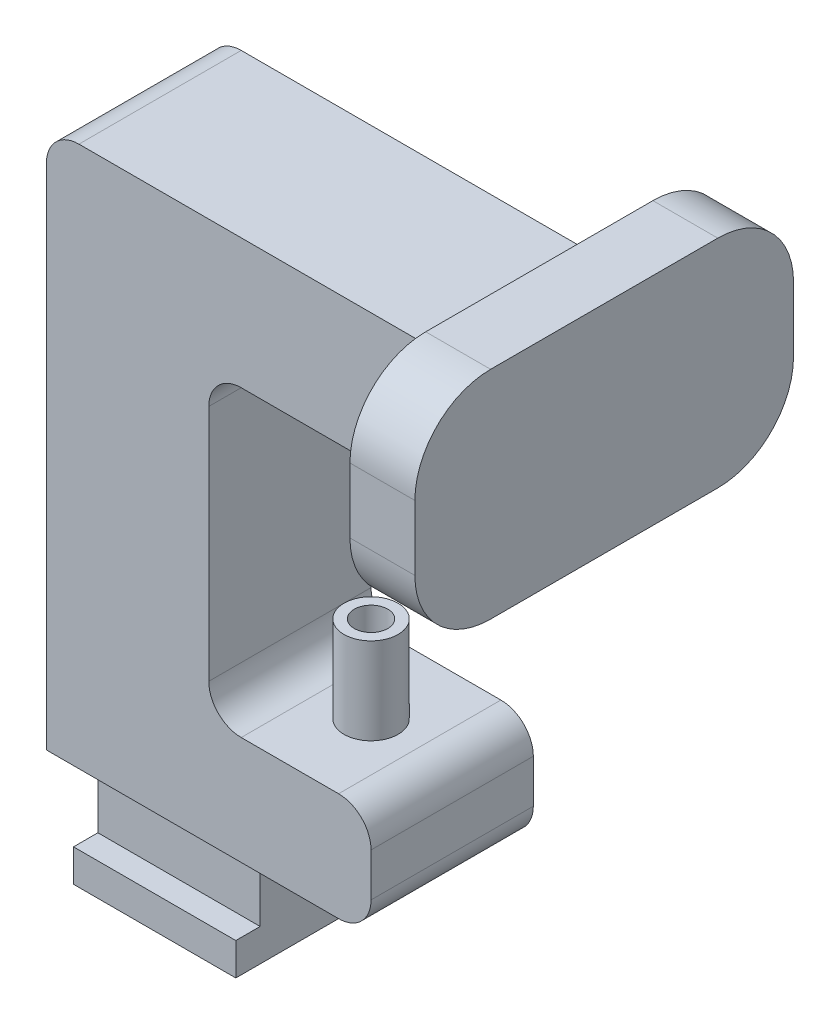
ISO-10303-21;
HEADER;
FILE_DESCRIPTION(('STEP AP214'),'2;1');
FILE_NAME('part.step','',(''),(''),'','','');
FILE_SCHEMA(('AUTOMOTIVE_DESIGN { 1 0 10303 214 1 1 1 1 }'));
ENDSEC;
DATA;
#1=APPLICATION_CONTEXT('core data for automotive mechanical design processes');
#2=APPLICATION_PROTOCOL_DEFINITION('international standard','automotive_design',2000,#1);
#3=PRODUCT_CONTEXT('',#1,'mechanical');
#4=PRODUCT('Part','Part','',(#3));
#5=PRODUCT_RELATED_PRODUCT_CATEGORY('part','',(#4));
#6=PRODUCT_DEFINITION_FORMATION('','',#4);
#7=PRODUCT_DEFINITION_CONTEXT('part definition',#1,'design');
#8=PRODUCT_DEFINITION('design','',#6,#7);
#9=PRODUCT_DEFINITION_SHAPE('','',#8);
#10=(LENGTH_UNIT() NAMED_UNIT(*) SI_UNIT(.MILLI.,.METRE.));
#11=(NAMED_UNIT(*) PLANE_ANGLE_UNIT() SI_UNIT($,.RADIAN.));
#12=(NAMED_UNIT(*) SI_UNIT($,.STERADIAN.) SOLID_ANGLE_UNIT());
#13=UNCERTAINTY_MEASURE_WITH_UNIT(LENGTH_MEASURE(1.E-05),#10,'distance_accuracy_value','');
#14=(GEOMETRIC_REPRESENTATION_CONTEXT(3) GLOBAL_UNCERTAINTY_ASSIGNED_CONTEXT((#13)) GLOBAL_UNIT_ASSIGNED_CONTEXT((#10,
#11,#12)) REPRESENTATION_CONTEXT('',''));
#15=CARTESIAN_POINT('',(0.,0.,0.));
#16=DIRECTION('',(0.,0.,1.));
#17=DIRECTION('',(1.,0.,0.));
#18=AXIS2_PLACEMENT_3D('',#15,#16,#17);
#19=CARTESIAN_POINT('',(10.,0.,15.));
#20=DIRECTION('',(-1.,0.,0.));
#21=DIRECTION('',(0.,0.,1.));
#22=AXIS2_PLACEMENT_3D('',#19,#20,#21);
#23=PLANE('',#22);
#24=DIRECTION('',(0.,1.,0.));
#25=VECTOR('',#24,1.);
#26=CARTESIAN_POINT('',(10.,0.,15.));
#27=LINE('',#26,#25);
#28=CARTESIAN_POINT('',(10.,-37.,15.));
#29=VERTEX_POINT('',#28);
#30=CARTESIAN_POINT('',(10.,-15.,15.));
#31=VERTEX_POINT('',#30);
#32=EDGE_CURVE('E407',#29,#31,#27,.T.);
#33=ORIENTED_EDGE('',*,*,#32,.F.);
#34=DIRECTION('',(0.,0.,-1.));
#35=VECTOR('',#34,1.);
#36=CARTESIAN_POINT('',(10.,-37.,0.));
#37=LINE('',#36,#35);
#38=CARTESIAN_POINT('',(10.,-37.,0.));
#39=VERTEX_POINT('',#38);
#40=EDGE_CURVE('E516',#29,#39,#37,.T.);
#41=ORIENTED_EDGE('',*,*,#40,.T.);
#42=DIRECTION('',(0.,1.,0.));
#43=VECTOR('',#42,1.);
#44=CARTESIAN_POINT('',(10.,0.,0.));
#45=LINE('',#44,#43);
#46=CARTESIAN_POINT('',(10.,-15.,0.));
#47=VERTEX_POINT('',#46);
#48=EDGE_CURVE('E395',#39,#47,#45,.T.);
#49=ORIENTED_EDGE('',*,*,#48,.T.);
#50=DIRECTION('',(0.,0.,-1.));
#51=VECTOR('',#50,1.);
#52=CARTESIAN_POINT('',(10.,-15.,15.));
#53=LINE('',#52,#51);
#54=EDGE_CURVE('E513',#47,#31,#53,.F.);
#55=ORIENTED_EDGE('',*,*,#54,.T.);
#56=EDGE_LOOP('',(#33,#41,#49,#55));
#57=FACE_BOUND('',#56,.T.);
#58=ADVANCED_FACE('F49',(#57),#23,.F.);
#59=CARTESIAN_POINT('',(10.,-40.,15.));
#60=DIRECTION('',(0.,-1.,0.));
#61=DIRECTION('',(0.,0.,-1.));
#62=AXIS2_PLACEMENT_3D('',#59,#60,#61);
#63=PLANE('',#62);
#64=DIRECTION('',(-1.,0.,0.));
#65=VECTOR('',#64,1.);
#66=CARTESIAN_POINT('',(10.,-40.,15.));
#67=LINE('',#66,#65);
#68=CARTESIAN_POINT('',(22.,-40.,15.));
#69=VERTEX_POINT('',#68);
#70=CARTESIAN_POINT('',(13.,-40.,15.));
#71=VERTEX_POINT('',#70);
#72=EDGE_CURVE('E403',#69,#71,#67,.T.);
#73=ORIENTED_EDGE('',*,*,#72,.F.);
#74=DIRECTION('',(0.,0.,-1.));
#75=VECTOR('',#74,1.);
#76=CARTESIAN_POINT('',(22.,-40.,15.));
#77=LINE('',#76,#75);
#78=CARTESIAN_POINT('',(22.,-40.,0.));
#79=VERTEX_POINT('',#78);
#80=EDGE_CURVE('E509',#69,#79,#77,.T.);
#81=ORIENTED_EDGE('',*,*,#80,.T.);
#82=DIRECTION('',(-1.,0.,0.));
#83=VECTOR('',#82,1.);
#84=CARTESIAN_POINT('',(10.,-40.,0.));
#85=LINE('',#84,#83);
#86=CARTESIAN_POINT('',(13.,-40.,0.));
#87=VERTEX_POINT('',#86);
#88=EDGE_CURVE('E417',#79,#87,#85,.T.);
#89=ORIENTED_EDGE('',*,*,#88,.T.);
#90=DIRECTION('',(0.,0.,-1.));
#91=VECTOR('',#90,1.);
#92=CARTESIAN_POINT('',(13.,-40.,15.));
#93=LINE('',#92,#91);
#94=EDGE_CURVE('E506',#87,#71,#93,.F.);
#95=ORIENTED_EDGE('',*,*,#94,.T.);
#96=EDGE_LOOP('',(#73,#81,#89,#95));
#97=FACE_BOUND('',#96,.T.);
#98=CARTESIAN_POINT('',(17.5,-40.,7.5));
#99=DIRECTION('',(0.,-1.,0.));
#100=DIRECTION('',(0.,0.,-1.));
#101=AXIS2_PLACEMENT_3D('',#98,#99,#100);
#102=CIRCLE('',#101,2.5);
#103=CARTESIAN_POINT('',(17.5,-40.,5.));
#104=VERTEX_POINT('',#103);
#105=EDGE_CURVE('E411',#104,#104,#102,.F.);
#106=ORIENTED_EDGE('',*,*,#105,.F.);
#107=EDGE_LOOP('',(#106));
#108=FACE_BOUND('',#107,.T.);
#109=ADVANCED_FACE('F661',(#97,#108),#63,.F.);
#110=CARTESIAN_POINT('',(0.,-50.,15.));
#111=DIRECTION('',(0.,1.,0.));
#112=DIRECTION('',(0.,0.,1.));
#113=AXIS2_PLACEMENT_3D('',#110,#111,#112);
#114=PLANE('',#113);
#115=CARTESIAN_POINT('',(17.5,-50.,7.5));
#116=DIRECTION('',(0.,1.,0.));
#117=DIRECTION('',(0.,0.,1.));
#118=AXIS2_PLACEMENT_3D('',#115,#116,#117);
#119=CIRCLE('',#118,1.55);
#120=CARTESIAN_POINT('',(17.5,-50.,9.05));
#121=VERTEX_POINT('',#120);
#122=EDGE_CURVE('E335',#121,#121,#119,.T.);
#123=ORIENTED_EDGE('',*,*,#122,.T.);
#124=EDGE_LOOP('',(#123));
#125=FACE_BOUND('',#124,.T.);
#126=DIRECTION('',(1.,0.,0.));
#127=VECTOR('',#126,1.);
#128=CARTESIAN_POINT('',(0.,-50.,0.));
#129=LINE('',#128,#127);
#130=CARTESIAN_POINT('',(-5.,-50.,0.));
#131=VERTEX_POINT('',#130);
#132=CARTESIAN_POINT('',(22.,-50.,0.));
#133=VERTEX_POINT('',#132);
#134=EDGE_CURVE('E270',#131,#133,#129,.T.);
#135=ORIENTED_EDGE('',*,*,#134,.T.);
#136=DIRECTION('',(0.,0.,-1.));
#137=VECTOR('',#136,1.);
#138=CARTESIAN_POINT('',(22.,-50.,15.));
#139=LINE('',#138,#137);
#140=CARTESIAN_POINT('',(22.,-50.,15.));
#141=VERTEX_POINT('',#140);
#142=EDGE_CURVE('E494',#133,#141,#139,.F.);
#143=ORIENTED_EDGE('',*,*,#142,.T.);
#144=DIRECTION('',(1.,0.,0.));
#145=VECTOR('',#144,1.);
#146=CARTESIAN_POINT('',(0.,-50.,15.));
#147=LINE('',#146,#145);
#148=CARTESIAN_POINT('',(-5.,-50.,15.));
#149=VERTEX_POINT('',#148);
#150=EDGE_CURVE('E394',#149,#141,#147,.T.);
#151=ORIENTED_EDGE('',*,*,#150,.F.);
#152=DIRECTION('',(0.,0.,1.));
#153=VECTOR('',#152,1.);
#154=CARTESIAN_POINT('',(-5.,-50.,10.25));
#155=LINE('',#154,#153);
#156=CARTESIAN_POINT('',(-5.,-50.,10.25));
#157=VERTEX_POINT('',#156);
#158=EDGE_CURVE('E314',#157,#149,#155,.T.);
#159=ORIENTED_EDGE('',*,*,#158,.F.);
#160=DIRECTION('',(-1.,0.,0.));
#161=VECTOR('',#160,1.);
#162=CARTESIAN_POINT('',(10.,-50.,10.25));
#163=LINE('',#162,#161);
#164=CARTESIAN_POINT('',(10.,-50.,10.25));
#165=VERTEX_POINT('',#164);
#166=EDGE_CURVE('E368',#165,#157,#163,.T.);
#167=ORIENTED_EDGE('',*,*,#166,.F.);
#168=DIRECTION('',(0.,0.,1.));
#169=VECTOR('',#168,1.);
#170=CARTESIAN_POINT('',(10.,-50.,0.));
#171=LINE('',#170,#169);
#172=CARTESIAN_POINT('',(10.,-50.,4.75000000000001));
#173=VERTEX_POINT('',#172);
#174=EDGE_CURVE('E343',#173,#165,#171,.T.);
#175=ORIENTED_EDGE('',*,*,#174,.F.);
#176=DIRECTION('',(-1.,0.,0.));
#177=VECTOR('',#176,1.);
#178=CARTESIAN_POINT('',(10.,-50.,4.75000000000001));
#179=LINE('',#178,#177);
#180=CARTESIAN_POINT('',(-5.,-50.,4.75000000000001));
#181=VERTEX_POINT('',#180);
#182=EDGE_CURVE('E282',#173,#181,#179,.T.);
#183=ORIENTED_EDGE('',*,*,#182,.T.);
#184=DIRECTION('',(0.,0.,1.));
#185=VECTOR('',#184,1.);
#186=CARTESIAN_POINT('',(-5.,-50.,0.));
#187=LINE('',#186,#185);
#188=EDGE_CURVE('E261',#131,#181,#187,.T.);
#189=ORIENTED_EDGE('',*,*,#188,.F.);
#190=EDGE_LOOP('',(#135,#143,#151,#159,#167,#175,#183,#189));
#191=FACE_BOUND('',#190,.T.);
#192=ADVANCED_FACE('F280',(#125,#191),#114,.F.);
#193=CARTESIAN_POINT('',(0.,0.,15.));
#194=DIRECTION('',(0.,-1.,0.));
#195=DIRECTION('',(0.,0.,-1.));
#196=AXIS2_PLACEMENT_3D('',#193,#194,#195);
#197=PLANE('',#196);
#198=DIRECTION('',(-1.,0.,0.));
#199=VECTOR('',#198,1.);
#200=CARTESIAN_POINT('',(0.,0.,15.));
#201=LINE('',#200,#199);
#202=CARTESIAN_POINT('',(32.05,0.,15.));
#203=VERTEX_POINT('',#202);
#204=CARTESIAN_POINT('',(-2.,0.,15.));
#205=VERTEX_POINT('',#204);
#206=EDGE_CURVE('E391',#203,#205,#201,.T.);
#207=ORIENTED_EDGE('',*,*,#206,.F.);
#208=DIRECTION('',(0.,0.,1.));
#209=VECTOR('',#208,1.);
#210=CARTESIAN_POINT('',(32.05,0.,15.));
#211=LINE('',#210,#209);
#212=CARTESIAN_POINT('',(32.05,0.,0.));
#213=VERTEX_POINT('',#212);
#214=EDGE_CURVE('E73',#203,#213,#211,.F.);
#215=ORIENTED_EDGE('',*,*,#214,.T.);
#216=DIRECTION('',(-1.,0.,0.));
#217=VECTOR('',#216,1.);
#218=CARTESIAN_POINT('',(0.,0.,0.));
#219=LINE('',#218,#217);
#220=CARTESIAN_POINT('',(-2.,0.,0.));
#221=VERTEX_POINT('',#220);
#222=EDGE_CURVE('E278',#213,#221,#219,.T.);
#223=ORIENTED_EDGE('',*,*,#222,.T.);
#224=DIRECTION('',(0.,0.,-1.));
#225=VECTOR('',#224,1.);
#226=CARTESIAN_POINT('',(-2.,0.,15.));
#227=LINE('',#226,#225);
#228=EDGE_CURVE('E526',#221,#205,#227,.F.);
#229=ORIENTED_EDGE('',*,*,#228,.T.);
#230=EDGE_LOOP('',(#207,#215,#223,#229));
#231=FACE_BOUND('',#230,.T.);
#232=ADVANCED_FACE('F678',(#231),#197,.F.);
#233=CARTESIAN_POINT('',(25.,-50.,15.));
#234=DIRECTION('',(-1.,0.,0.));
#235=DIRECTION('',(0.,0.,1.));
#236=AXIS2_PLACEMENT_3D('',#233,#234,#235);
#237=PLANE('',#236);
#238=DIRECTION('',(0.,1.,0.));
#239=VECTOR('',#238,1.);
#240=CARTESIAN_POINT('',(25.,-50.,15.));
#241=LINE('',#240,#239);
#242=CARTESIAN_POINT('',(25.,-47.,15.));
#243=VERTEX_POINT('',#242);
#244=CARTESIAN_POINT('',(25.,-43.,15.));
#245=VERTEX_POINT('',#244);
#246=EDGE_CURVE('E399',#243,#245,#241,.T.);
#247=ORIENTED_EDGE('',*,*,#246,.F.);
#248=DIRECTION('',(0.,0.,-1.));
#249=VECTOR('',#248,1.);
#250=CARTESIAN_POINT('',(25.,-47.,15.));
#251=LINE('',#250,#249);
#252=CARTESIAN_POINT('',(25.,-47.,0.));
#253=VERTEX_POINT('',#252);
#254=EDGE_CURVE('E482',#243,#253,#251,.T.);
#255=ORIENTED_EDGE('',*,*,#254,.T.);
#256=DIRECTION('',(0.,1.,0.));
#257=VECTOR('',#256,1.);
#258=CARTESIAN_POINT('',(25.,-50.,0.));
#259=LINE('',#258,#257);
#260=CARTESIAN_POINT('',(25.,-43.,0.));
#261=VERTEX_POINT('',#260);
#262=EDGE_CURVE('E277',#253,#261,#259,.T.);
#263=ORIENTED_EDGE('',*,*,#262,.T.);
#264=DIRECTION('',(0.,0.,-1.));
#265=VECTOR('',#264,1.);
#266=CARTESIAN_POINT('',(25.,-43.,15.));
#267=LINE('',#266,#265);
#268=EDGE_CURVE('E479',#261,#245,#267,.F.);
#269=ORIENTED_EDGE('',*,*,#268,.T.);
#270=EDGE_LOOP('',(#247,#255,#263,#269));
#271=FACE_BOUND('',#270,.T.);
#272=ADVANCED_FACE('F674',(#271),#237,.F.);
#273=CARTESIAN_POINT('',(0.,0.,15.));
#274=DIRECTION('',(0.,0.,-1.));
#275=DIRECTION('',(-1.,0.,0.));
#276=AXIS2_PLACEMENT_3D('',#273,#274,#275);
#277=PLANE('',#276);
#278=DIRECTION('',(-1.,0.,0.));
#279=VECTOR('',#278,1.);
#280=CARTESIAN_POINT('',(33.05,-12.,15.));
#281=LINE('',#280,#279);
#282=CARTESIAN_POINT('',(32.05,-12.,15.));
#283=VERTEX_POINT('',#282);
#284=CARTESIAN_POINT('',(13.,-12.,15.));
#285=VERTEX_POINT('',#284);
#286=EDGE_CURVE('E324',#283,#285,#281,.T.);
#287=ORIENTED_EDGE('',*,*,#286,.F.);
#288=DIRECTION('',(0.,-1.,0.));
#289=VECTOR('',#288,1.);
#290=CARTESIAN_POINT('',(32.05,0.,15.));
#291=LINE('',#290,#289);
#292=EDGE_CURVE('E556',#283,#203,#291,.F.);
#293=ORIENTED_EDGE('',*,*,#292,.T.);
#294=ORIENTED_EDGE('',*,*,#206,.T.);
#295=CARTESIAN_POINT('',(-2.,-3.,15.));
#296=DIRECTION('',(0.,0.,-1.));
#297=DIRECTION('',(-1.,0.,0.));
#298=AXIS2_PLACEMENT_3D('',#295,#296,#297);
#299=CIRCLE('',#298,3.);
#300=CARTESIAN_POINT('',(-5.,-3.00000000000002,15.));
#301=VERTEX_POINT('',#300);
#302=EDGE_CURVE('E497',#205,#301,#299,.F.);
#303=ORIENTED_EDGE('',*,*,#302,.T.);
#304=DIRECTION('',(0.,1.,0.));
#305=VECTOR('',#304,1.);
#306=CARTESIAN_POINT('',(-5.,-50.,15.));
#307=LINE('',#306,#305);
#308=EDGE_CURVE('E318',#149,#301,#307,.T.);
#309=ORIENTED_EDGE('',*,*,#308,.F.);
#310=ORIENTED_EDGE('',*,*,#150,.T.);
#311=CARTESIAN_POINT('',(22.,-47.,15.));
#312=DIRECTION('',(0.,0.,-1.));
#313=DIRECTION('',(-1.,0.,0.));
#314=AXIS2_PLACEMENT_3D('',#311,#312,#313);
#315=CIRCLE('',#314,3.);
#316=EDGE_CURVE('E503',#141,#243,#315,.F.);
#317=ORIENTED_EDGE('',*,*,#316,.T.);
#318=ORIENTED_EDGE('',*,*,#246,.T.);
#319=CARTESIAN_POINT('',(22.,-43.,15.));
#320=DIRECTION('',(0.,0.,-1.));
#321=DIRECTION('',(-1.,0.,0.));
#322=AXIS2_PLACEMENT_3D('',#319,#320,#321);
#323=CIRCLE('',#322,3.);
#324=EDGE_CURVE('E500',#245,#69,#323,.F.);
#325=ORIENTED_EDGE('',*,*,#324,.T.);
#326=ORIENTED_EDGE('',*,*,#72,.T.);
#327=CARTESIAN_POINT('',(13.,-37.,15.));
#328=DIRECTION('',(0.,0.,-1.));
#329=DIRECTION('',(-1.,0.,0.));
#330=AXIS2_PLACEMENT_3D('',#327,#328,#329);
#331=CIRCLE('',#330,3.);
#332=EDGE_CURVE('E533',#71,#29,#331,.T.);
#333=ORIENTED_EDGE('',*,*,#332,.T.);
#334=ORIENTED_EDGE('',*,*,#32,.T.);
#335=CARTESIAN_POINT('',(13.,-15.,15.));
#336=DIRECTION('',(0.,0.,-1.));
#337=DIRECTION('',(-1.,0.,0.));
#338=AXIS2_PLACEMENT_3D('',#335,#336,#337);
#339=CIRCLE('',#338,3.);
#340=EDGE_CURVE('E539',#31,#285,#339,.T.);
#341=ORIENTED_EDGE('',*,*,#340,.T.);
#342=EDGE_LOOP('',(#287,#293,#294,#303,#309,#310,#317,#318,#325,#326,#333,#334,#341));
#343=FACE_BOUND('',#342,.T.);
#344=ADVANCED_FACE('F677',(#343),#277,.F.);
#345=CARTESIAN_POINT('',(0.,0.,0.));
#346=DIRECTION('',(0.,0.,-1.));
#347=DIRECTION('',(-1.,0.,0.));
#348=AXIS2_PLACEMENT_3D('',#345,#346,#347);
#349=PLANE('',#348);
#350=ORIENTED_EDGE('',*,*,#222,.F.);
#351=DIRECTION('',(0.,1.,0.));
#352=VECTOR('',#351,1.);
#353=CARTESIAN_POINT('',(32.05,-12.,0.));
#354=LINE('',#353,#352);
#355=CARTESIAN_POINT('',(32.05,-12.,0.));
#356=VERTEX_POINT('',#355);
#357=EDGE_CURVE('E11',#213,#356,#354,.F.);
#358=ORIENTED_EDGE('',*,*,#357,.T.);
#359=DIRECTION('',(-1.,0.,0.));
#360=VECTOR('',#359,1.);
#361=CARTESIAN_POINT('',(33.05,-12.,0.));
#362=LINE('',#361,#360);
#363=CARTESIAN_POINT('',(13.,-12.,0.));
#364=VERTEX_POINT('',#363);
#365=EDGE_CURVE('E321',#356,#364,#362,.T.);
#366=ORIENTED_EDGE('',*,*,#365,.T.);
#367=CARTESIAN_POINT('',(13.,-15.,0.));
#368=DIRECTION('',(0.,0.,-1.));
#369=DIRECTION('',(-1.,0.,0.));
#370=AXIS2_PLACEMENT_3D('',#367,#368,#369);
#371=CIRCLE('',#370,3.);
#372=EDGE_CURVE('E536',#364,#47,#371,.F.);
#373=ORIENTED_EDGE('',*,*,#372,.T.);
#374=ORIENTED_EDGE('',*,*,#48,.F.);
#375=CARTESIAN_POINT('',(13.,-37.,0.));
#376=DIRECTION('',(0.,0.,-1.));
#377=DIRECTION('',(-1.,0.,0.));
#378=AXIS2_PLACEMENT_3D('',#375,#376,#377);
#379=CIRCLE('',#378,3.);
#380=EDGE_CURVE('E530',#39,#87,#379,.F.);
#381=ORIENTED_EDGE('',*,*,#380,.T.);
#382=ORIENTED_EDGE('',*,*,#88,.F.);
#383=CARTESIAN_POINT('',(22.,-43.,0.));
#384=DIRECTION('',(0.,0.,-1.));
#385=DIRECTION('',(-1.,0.,0.));
#386=AXIS2_PLACEMENT_3D('',#383,#384,#385);
#387=CIRCLE('',#386,3.);
#388=EDGE_CURVE('E489',#79,#261,#387,.T.);
#389=ORIENTED_EDGE('',*,*,#388,.T.);
#390=ORIENTED_EDGE('',*,*,#262,.F.);
#391=CARTESIAN_POINT('',(22.,-47.,0.));
#392=DIRECTION('',(0.,0.,-1.));
#393=DIRECTION('',(-1.,0.,0.));
#394=AXIS2_PLACEMENT_3D('',#391,#392,#393);
#395=CIRCLE('',#394,3.);
#396=EDGE_CURVE('E273',#253,#133,#395,.T.);
#397=ORIENTED_EDGE('',*,*,#396,.T.);
#398=ORIENTED_EDGE('',*,*,#134,.F.);
#399=DIRECTION('',(0.,-1.,0.));
#400=VECTOR('',#399,1.);
#401=CARTESIAN_POINT('',(-5.,0.,0.));
#402=LINE('',#401,#400);
#403=CARTESIAN_POINT('',(-5.,-3.,0.));
#404=VERTEX_POINT('',#403);
#405=EDGE_CURVE('E255',#404,#131,#402,.T.);
#406=ORIENTED_EDGE('',*,*,#405,.F.);
#407=CARTESIAN_POINT('',(-2.,-3.,0.));
#408=DIRECTION('',(0.,0.,-1.));
#409=DIRECTION('',(-1.,0.,0.));
#410=AXIS2_PLACEMENT_3D('',#407,#408,#409);
#411=CIRCLE('',#410,3.);
#412=EDGE_CURVE('E486',#404,#221,#411,.T.);
#413=ORIENTED_EDGE('',*,*,#412,.T.);
#414=EDGE_LOOP('',(#350,#358,#366,#373,#374,#381,#382,#389,#390,#397,#398,#406,#413));
#415=FACE_BOUND('',#414,.T.);
#416=ADVANCED_FACE('F271',(#415),#349,.T.);
#417=CARTESIAN_POINT('',(10.,0.,10.25));
#418=DIRECTION('',(0.,0.,-1.));
#419=DIRECTION('',(-1.,0.,0.));
#420=AXIS2_PLACEMENT_3D('',#417,#418,#419);
#421=PLANE('',#420);
#422=ORIENTED_EDGE('',*,*,#166,.T.);
#423=DIRECTION('',(0.,1.,0.));
#424=VECTOR('',#423,1.);
#425=CARTESIAN_POINT('',(-5.,-59.,10.25));
#426=LINE('',#425,#424);
#427=CARTESIAN_POINT('',(-5.,-59.,10.25));
#428=VERTEX_POINT('',#427);
#429=EDGE_CURVE('E310',#428,#157,#426,.T.);
#430=ORIENTED_EDGE('',*,*,#429,.F.);
#431=DIRECTION('',(-1.,0.,0.));
#432=VECTOR('',#431,1.);
#433=CARTESIAN_POINT('',(10.,-59.,10.25));
#434=LINE('',#433,#432);
#435=CARTESIAN_POINT('',(10.,-59.,10.25));
#436=VERTEX_POINT('',#435);
#437=EDGE_CURVE('E369',#436,#428,#434,.T.);
#438=ORIENTED_EDGE('',*,*,#437,.F.);
#439=DIRECTION('',(0.,-1.,0.));
#440=VECTOR('',#439,1.);
#441=CARTESIAN_POINT('',(10.,0.,10.25));
#442=LINE('',#441,#440);
#443=EDGE_CURVE('E339',#165,#436,#442,.T.);
#444=ORIENTED_EDGE('',*,*,#443,.F.);
#445=EDGE_LOOP('',(#422,#430,#438,#444));
#446=FACE_BOUND('',#445,.T.);
#447=ADVANCED_FACE('F760',(#446),#421,.F.);
#448=CARTESIAN_POINT('',(10.,-59.,0.));
#449=DIRECTION('',(0.,-1.,0.));
#450=DIRECTION('',(0.,0.,-1.));
#451=AXIS2_PLACEMENT_3D('',#448,#449,#450);
#452=PLANE('',#451);
#453=ORIENTED_EDGE('',*,*,#437,.T.);
#454=DIRECTION('',(0.,0.,-1.));
#455=VECTOR('',#454,1.);
#456=CARTESIAN_POINT('',(-5.,-59.,12.5));
#457=LINE('',#456,#455);
#458=CARTESIAN_POINT('',(-5.,-59.,12.5));
#459=VERTEX_POINT('',#458);
#460=EDGE_CURVE('E306',#459,#428,#457,.T.);
#461=ORIENTED_EDGE('',*,*,#460,.F.);
#462=DIRECTION('',(-1.,0.,0.));
#463=VECTOR('',#462,1.);
#464=CARTESIAN_POINT('',(10.,-59.,12.5));
#465=LINE('',#464,#463);
#466=CARTESIAN_POINT('',(10.,-59.,12.5));
#467=VERTEX_POINT('',#466);
#468=EDGE_CURVE('E372',#467,#459,#465,.T.);
#469=ORIENTED_EDGE('',*,*,#468,.F.);
#470=DIRECTION('',(0.,0.,1.));
#471=VECTOR('',#470,1.);
#472=CARTESIAN_POINT('',(10.,-59.,0.));
#473=LINE('',#472,#471);
#474=EDGE_CURVE('E365',#436,#467,#473,.T.);
#475=ORIENTED_EDGE('',*,*,#474,.F.);
#476=EDGE_LOOP('',(#453,#461,#469,#475));
#477=FACE_BOUND('',#476,.T.);
#478=ADVANCED_FACE('F974',(#477),#452,.F.);
#479=CARTESIAN_POINT('',(10.,0.,12.5));
#480=DIRECTION('',(0.,0.,-1.));
#481=DIRECTION('',(0.,1.,0.));
#482=AXIS2_PLACEMENT_3D('',#479,#480,#481);
#483=PLANE('',#482);
#484=ORIENTED_EDGE('',*,*,#468,.T.);
#485=DIRECTION('',(0.,1.,0.));
#486=VECTOR('',#485,1.);
#487=CARTESIAN_POINT('',(-5.,-62.,12.5));
#488=LINE('',#487,#486);
#489=CARTESIAN_POINT('',(-5.,-62.,12.5));
#490=VERTEX_POINT('',#489);
#491=EDGE_CURVE('E302',#490,#459,#488,.T.);
#492=ORIENTED_EDGE('',*,*,#491,.F.);
#493=DIRECTION('',(-1.,0.,0.));
#494=VECTOR('',#493,1.);
#495=CARTESIAN_POINT('',(10.,-62.,12.5));
#496=LINE('',#495,#494);
#497=CARTESIAN_POINT('',(10.,-62.,12.5));
#498=VERTEX_POINT('',#497);
#499=EDGE_CURVE('E375',#498,#490,#496,.T.);
#500=ORIENTED_EDGE('',*,*,#499,.F.);
#501=DIRECTION('',(0.,-1.,0.));
#502=VECTOR('',#501,1.);
#503=CARTESIAN_POINT('',(10.,0.,12.5));
#504=LINE('',#503,#502);
#505=EDGE_CURVE('E362',#467,#498,#504,.T.);
#506=ORIENTED_EDGE('',*,*,#505,.F.);
#507=EDGE_LOOP('',(#484,#492,#500,#506));
#508=FACE_BOUND('',#507,.T.);
#509=ADVANCED_FACE('F965',(#508),#483,.F.);
#510=CARTESIAN_POINT('',(10.,-62.,0.));
#511=DIRECTION('',(0.,-1.,0.));
#512=DIRECTION('',(0.,0.,-1.));
#513=AXIS2_PLACEMENT_3D('',#510,#511,#512);
#514=PLANE('',#513);
#515=ORIENTED_EDGE('',*,*,#499,.T.);
#516=DIRECTION('',(0.,0.,1.));
#517=VECTOR('',#516,1.);
#518=CARTESIAN_POINT('',(-5.,-62.,2.50000000000001));
#519=LINE('',#518,#517);
#520=CARTESIAN_POINT('',(-5.,-62.,2.50000000000001));
#521=VERTEX_POINT('',#520);
#522=EDGE_CURVE('E298',#521,#490,#519,.T.);
#523=ORIENTED_EDGE('',*,*,#522,.F.);
#524=DIRECTION('',(-1.,0.,0.));
#525=VECTOR('',#524,1.);
#526=CARTESIAN_POINT('',(10.,-62.,2.50000000000001));
#527=LINE('',#526,#525);
#528=CARTESIAN_POINT('',(10.,-62.,2.50000000000001));
#529=VERTEX_POINT('',#528);
#530=EDGE_CURVE('E378',#529,#521,#527,.T.);
#531=ORIENTED_EDGE('',*,*,#530,.F.);
#532=DIRECTION('',(0.,0.,1.));
#533=VECTOR('',#532,1.);
#534=CARTESIAN_POINT('',(10.,-62.,0.));
#535=LINE('',#534,#533);
#536=EDGE_CURVE('E358',#529,#498,#535,.T.);
#537=ORIENTED_EDGE('',*,*,#536,.T.);
#538=EDGE_LOOP('',(#515,#523,#531,#537));
#539=FACE_BOUND('',#538,.T.);
#540=ADVANCED_FACE('F956',(#539),#514,.T.);
#541=CARTESIAN_POINT('',(10.,0.,2.5));
#542=DIRECTION('',(0.,0.,-1.));
#543=DIRECTION('',(0.,1.,0.));
#544=AXIS2_PLACEMENT_3D('',#541,#542,#543);
#545=PLANE('',#544);
#546=ORIENTED_EDGE('',*,*,#530,.T.);
#547=DIRECTION('',(0.,-1.,0.));
#548=VECTOR('',#547,1.);
#549=CARTESIAN_POINT('',(-5.,-59.,2.50000000000001));
#550=LINE('',#549,#548);
#551=CARTESIAN_POINT('',(-5.,-59.,2.50000000000001));
#552=VERTEX_POINT('',#551);
#553=EDGE_CURVE('E294',#552,#521,#550,.T.);
#554=ORIENTED_EDGE('',*,*,#553,.F.);
#555=DIRECTION('',(-1.,0.,0.));
#556=VECTOR('',#555,1.);
#557=CARTESIAN_POINT('',(10.,-59.,2.50000000000001));
#558=LINE('',#557,#556);
#559=CARTESIAN_POINT('',(10.,-59.,2.50000000000001));
#560=VERTEX_POINT('',#559);
#561=EDGE_CURVE('E381',#560,#552,#558,.T.);
#562=ORIENTED_EDGE('',*,*,#561,.F.);
#563=DIRECTION('',(0.,-1.,0.));
#564=VECTOR('',#563,1.);
#565=CARTESIAN_POINT('',(10.,0.,2.5));
#566=LINE('',#565,#564);
#567=EDGE_CURVE('E354',#560,#529,#566,.T.);
#568=ORIENTED_EDGE('',*,*,#567,.T.);
#569=EDGE_LOOP('',(#546,#554,#562,#568));
#570=FACE_BOUND('',#569,.T.);
#571=ADVANCED_FACE('F947',(#570),#545,.T.);
#572=CARTESIAN_POINT('',(10.,-59.,0.));
#573=DIRECTION('',(0.,1.,0.));
#574=DIRECTION('',(0.,0.,1.));
#575=AXIS2_PLACEMENT_3D('',#572,#573,#574);
#576=PLANE('',#575);
#577=ORIENTED_EDGE('',*,*,#561,.T.);
#578=DIRECTION('',(0.,0.,-1.));
#579=VECTOR('',#578,1.);
#580=CARTESIAN_POINT('',(-5.,-59.,4.75000000000001));
#581=LINE('',#580,#579);
#582=CARTESIAN_POINT('',(-5.,-59.,4.75000000000001));
#583=VERTEX_POINT('',#582);
#584=EDGE_CURVE('E287',#583,#552,#581,.T.);
#585=ORIENTED_EDGE('',*,*,#584,.F.);
#586=DIRECTION('',(-1.,0.,0.));
#587=VECTOR('',#586,1.);
#588=CARTESIAN_POINT('',(10.,-59.,4.75000000000001));
#589=LINE('',#588,#587);
#590=CARTESIAN_POINT('',(10.,-59.,4.75000000000001));
#591=VERTEX_POINT('',#590);
#592=EDGE_CURVE('E384',#591,#583,#589,.T.);
#593=ORIENTED_EDGE('',*,*,#592,.F.);
#594=DIRECTION('',(0.,0.,-1.));
#595=VECTOR('',#594,1.);
#596=CARTESIAN_POINT('',(10.,-59.,0.));
#597=LINE('',#596,#595);
#598=EDGE_CURVE('E350',#591,#560,#597,.T.);
#599=ORIENTED_EDGE('',*,*,#598,.T.);
#600=EDGE_LOOP('',(#577,#585,#593,#599));
#601=FACE_BOUND('',#600,.T.);
#602=ADVANCED_FACE('F938',(#601),#576,.T.);
#603=CARTESIAN_POINT('',(10.,0.,4.75));
#604=DIRECTION('',(0.,0.,-1.));
#605=DIRECTION('',(0.,1.,0.));
#606=AXIS2_PLACEMENT_3D('',#603,#604,#605);
#607=PLANE('',#606);
#608=ORIENTED_EDGE('',*,*,#592,.T.);
#609=DIRECTION('',(0.,-1.,0.));
#610=VECTOR('',#609,1.);
#611=CARTESIAN_POINT('',(-5.,-50.,4.75000000000001));
#612=LINE('',#611,#610);
#613=EDGE_CURVE('E284',#181,#583,#612,.T.);
#614=ORIENTED_EDGE('',*,*,#613,.F.);
#615=ORIENTED_EDGE('',*,*,#182,.F.);
#616=DIRECTION('',(0.,-1.,0.));
#617=VECTOR('',#616,1.);
#618=CARTESIAN_POINT('',(10.,0.,4.75));
#619=LINE('',#618,#617);
#620=EDGE_CURVE('E346',#173,#591,#619,.T.);
#621=ORIENTED_EDGE('',*,*,#620,.T.);
#622=EDGE_LOOP('',(#608,#614,#615,#621));
#623=FACE_BOUND('',#622,.T.);
#624=ADVANCED_FACE('F934',(#623),#607,.T.);
#625=CARTESIAN_POINT('',(10.,0.,0.));
#626=DIRECTION('',(-1.,0.,0.));
#627=DIRECTION('',(0.,0.,1.));
#628=AXIS2_PLACEMENT_3D('',#625,#626,#627);
#629=PLANE('',#628);
#630=ORIENTED_EDGE('',*,*,#443,.T.);
#631=ORIENTED_EDGE('',*,*,#474,.T.);
#632=ORIENTED_EDGE('',*,*,#505,.T.);
#633=ORIENTED_EDGE('',*,*,#536,.F.);
#634=ORIENTED_EDGE('',*,*,#567,.F.);
#635=ORIENTED_EDGE('',*,*,#598,.F.);
#636=ORIENTED_EDGE('',*,*,#620,.F.);
#637=ORIENTED_EDGE('',*,*,#174,.T.);
#638=EDGE_LOOP('',(#630,#631,#632,#633,#634,#635,#636,#637));
#639=FACE_BOUND('',#638,.T.);
#640=ADVANCED_FACE('F937',(#639),#629,.F.);
#641=CARTESIAN_POINT('',(17.5,-62.,7.5));
#642=DIRECTION('',(0.,1.,0.));
#643=DIRECTION('',(0.,0.,1.));
#644=AXIS2_PLACEMENT_3D('',#641,#642,#643);
#645=CYLINDRICAL_SURFACE('',#644,1.55);
#646=ORIENTED_EDGE('',*,*,#122,.F.);
#647=EDGE_LOOP('',(#646));
#648=FACE_BOUND('',#647,.T.);
#649=CARTESIAN_POINT('',(17.5,-32.,7.5));
#650=DIRECTION('',(0.,1.,0.));
#651=DIRECTION('',(0.,0.,1.));
#652=AXIS2_PLACEMENT_3D('',#649,#650,#651);
#653=CIRCLE('',#652,1.55);
#654=CARTESIAN_POINT('',(17.5,-32.,9.05));
#655=VERTEX_POINT('',#654);
#656=EDGE_CURVE('E327',#655,#655,#653,.T.);
#657=ORIENTED_EDGE('',*,*,#656,.T.);
#658=EDGE_LOOP('',(#657));
#659=FACE_BOUND('',#658,.T.);
#660=ADVANCED_FACE('F830',(#648,#659),#645,.F.);
#661=CARTESIAN_POINT('',(17.5,-32.,7.5));
#662=DIRECTION('',(0.,1.,0.));
#663=DIRECTION('',(0.,0.,1.));
#664=AXIS2_PLACEMENT_3D('',#661,#662,#663);
#665=PLANE('',#664);
#666=CARTESIAN_POINT('',(17.5,-32.,7.5));
#667=DIRECTION('',(0.,1.,0.));
#668=DIRECTION('',(0.,0.,1.));
#669=AXIS2_PLACEMENT_3D('',#666,#667,#668);
#670=CIRCLE('',#669,2.5);
#671=CARTESIAN_POINT('',(17.5,-32.,10.));
#672=VERTEX_POINT('',#671);
#673=EDGE_CURVE('E331',#672,#672,#670,.T.);
#674=ORIENTED_EDGE('',*,*,#673,.T.);
#675=EDGE_LOOP('',(#674));
#676=FACE_BOUND('',#675,.T.);
#677=ORIENTED_EDGE('',*,*,#656,.F.);
#678=EDGE_LOOP('',(#677));
#679=FACE_BOUND('',#678,.T.);
#680=ADVANCED_FACE('F833',(#676,#679),#665,.T.);
#681=CARTESIAN_POINT('',(17.5,-32.,7.5));
#682=DIRECTION('',(0.,-1.,0.));
#683=DIRECTION('',(0.,0.,-1.));
#684=AXIS2_PLACEMENT_3D('',#681,#682,#683);
#685=CYLINDRICAL_SURFACE('',#684,2.5);
#686=ORIENTED_EDGE('',*,*,#673,.F.);
#687=EDGE_LOOP('',(#686));
#688=FACE_BOUND('',#687,.T.);
#689=ORIENTED_EDGE('',*,*,#105,.T.);
#690=EDGE_LOOP('',(#689));
#691=FACE_BOUND('',#690,.T.);
#692=ADVANCED_FACE('F750',(#688,#691),#685,.T.);
#693=CARTESIAN_POINT('',(33.05,-12.,15.));
#694=DIRECTION('',(0.,1.,0.));
#695=DIRECTION('',(0.,0.,1.));
#696=AXIS2_PLACEMENT_3D('',#693,#694,#695);
#697=PLANE('',#696);
#698=ORIENTED_EDGE('',*,*,#365,.F.);
#699=DIRECTION('',(0.,0.,-1.));
#700=VECTOR('',#699,1.);
#701=CARTESIAN_POINT('',(32.05,-12.,15.));
#702=LINE('',#701,#700);
#703=EDGE_CURVE('E59',#356,#283,#702,.F.);
#704=ORIENTED_EDGE('',*,*,#703,.T.);
#705=ORIENTED_EDGE('',*,*,#286,.T.);
#706=DIRECTION('',(0.,0.,-1.));
#707=VECTOR('',#706,1.);
#708=CARTESIAN_POINT('',(13.,-12.,0.));
#709=LINE('',#708,#707);
#710=EDGE_CURVE('E520',#285,#364,#709,.T.);
#711=ORIENTED_EDGE('',*,*,#710,.T.);
#712=EDGE_LOOP('',(#698,#704,#705,#711));
#713=FACE_BOUND('',#712,.T.);
#714=ADVANCED_FACE('F731',(#713),#697,.F.);
#715=CARTESIAN_POINT('',(-5.,0.,0.));
#716=DIRECTION('',(-1.,0.,0.));
#717=DIRECTION('',(0.,0.,1.));
#718=AXIS2_PLACEMENT_3D('',#715,#716,#717);
#719=PLANE('',#718);
#720=ORIENTED_EDGE('',*,*,#308,.T.);
#721=DIRECTION('',(0.,0.,-1.));
#722=VECTOR('',#721,1.);
#723=CARTESIAN_POINT('',(-5.,-3.,0.));
#724=LINE('',#723,#722);
#725=EDGE_CURVE('E264',#301,#404,#724,.T.);
#726=ORIENTED_EDGE('',*,*,#725,.T.);
#727=ORIENTED_EDGE('',*,*,#405,.T.);
#728=ORIENTED_EDGE('',*,*,#188,.T.);
#729=ORIENTED_EDGE('',*,*,#613,.T.);
#730=ORIENTED_EDGE('',*,*,#584,.T.);
#731=ORIENTED_EDGE('',*,*,#553,.T.);
#732=ORIENTED_EDGE('',*,*,#522,.T.);
#733=ORIENTED_EDGE('',*,*,#491,.T.);
#734=ORIENTED_EDGE('',*,*,#460,.T.);
#735=ORIENTED_EDGE('',*,*,#429,.T.);
#736=ORIENTED_EDGE('',*,*,#158,.T.);
#737=EDGE_LOOP('',(#720,#726,#727,#728,#729,#730,#731,#732,#733,#734,#735,#736));
#738=FACE_BOUND('',#737,.T.);
#739=ADVANCED_FACE('F258',(#738),#719,.T.);
#740=CARTESIAN_POINT('',(39.05,-16.,-10.));
#741=DIRECTION('',(0.,0.,1.));
#742=DIRECTION('',(1.,0.,0.));
#743=AXIS2_PLACEMENT_3D('',#740,#741,#742);
#744=PLANE('',#743);
#745=DIRECTION('',(0.,1.,0.));
#746=VECTOR('',#745,1.);
#747=CARTESIAN_POINT('',(39.05,-16.,-10.));
#748=LINE('',#747,#746);
#749=CARTESIAN_POINT('',(39.05,-9.,-10.));
#750=VERTEX_POINT('',#749);
#751=CARTESIAN_POINT('',(39.05,-3.,-10.));
#752=VERTEX_POINT('',#751);
#753=EDGE_CURVE('E601',#750,#752,#748,.T.);
#754=ORIENTED_EDGE('',*,*,#753,.F.);
#755=DIRECTION('',(-1.,0.,0.));
#756=VECTOR('',#755,1.);
#757=CARTESIAN_POINT('',(39.05,-9.,-10.));
#758=LINE('',#757,#756);
#759=CARTESIAN_POINT('',(33.05,-9.,-10.));
#760=VERTEX_POINT('',#759);
#761=EDGE_CURVE('E468',#750,#760,#758,.T.);
#762=ORIENTED_EDGE('',*,*,#761,.T.);
#763=DIRECTION('',(0.,1.,0.));
#764=VECTOR('',#763,1.);
#765=CARTESIAN_POINT('',(33.05,-16.,-10.));
#766=LINE('',#765,#764);
#767=CARTESIAN_POINT('',(33.05,-3.,-10.));
#768=VERTEX_POINT('',#767);
#769=EDGE_CURVE('E578',#760,#768,#766,.T.);
#770=ORIENTED_EDGE('',*,*,#769,.T.);
#771=DIRECTION('',(-1.,0.,0.));
#772=VECTOR('',#771,1.);
#773=CARTESIAN_POINT('',(39.05,-3.,-10.));
#774=LINE('',#773,#772);
#775=EDGE_CURVE('E465',#768,#752,#774,.F.);
#776=ORIENTED_EDGE('',*,*,#775,.T.);
#777=EDGE_LOOP('',(#754,#762,#770,#776));
#778=FACE_BOUND('',#777,.T.);
#779=ADVANCED_FACE('F629',(#778),#744,.F.);
#780=CARTESIAN_POINT('',(39.05,4.,25.));
#781=DIRECTION('',(0.,-1.,0.));
#782=DIRECTION('',(0.,0.,-1.));
#783=AXIS2_PLACEMENT_3D('',#780,#781,#782);
#784=PLANE('',#783);
#785=DIRECTION('',(0.,0.,1.));
#786=VECTOR('',#785,1.);
#787=CARTESIAN_POINT('',(39.05,4.,25.));
#788=LINE('',#787,#786);
#789=CARTESIAN_POINT('',(39.05,4.,-3.));
#790=VERTEX_POINT('',#789);
#791=CARTESIAN_POINT('',(39.05,4.,18.));
#792=VERTEX_POINT('',#791);
#793=EDGE_CURVE('E607',#790,#792,#788,.T.);
#794=ORIENTED_EDGE('',*,*,#793,.F.);
#795=DIRECTION('',(-1.,0.,0.));
#796=VECTOR('',#795,1.);
#797=CARTESIAN_POINT('',(39.05,4.,-3.));
#798=LINE('',#797,#796);
#799=CARTESIAN_POINT('',(33.05,4.,-3.));
#800=VERTEX_POINT('',#799);
#801=EDGE_CURVE('E475',#790,#800,#798,.T.);
#802=ORIENTED_EDGE('',*,*,#801,.T.);
#803=DIRECTION('',(0.,0.,1.));
#804=VECTOR('',#803,1.);
#805=CARTESIAN_POINT('',(33.05,4.,25.));
#806=LINE('',#805,#804);
#807=CARTESIAN_POINT('',(33.05,4.,18.));
#808=VERTEX_POINT('',#807);
#809=EDGE_CURVE('E584',#800,#808,#806,.T.);
#810=ORIENTED_EDGE('',*,*,#809,.T.);
#811=DIRECTION('',(-1.,0.,0.));
#812=VECTOR('',#811,1.);
#813=CARTESIAN_POINT('',(39.05,4.,18.));
#814=LINE('',#813,#812);
#815=EDGE_CURVE('E472',#808,#792,#814,.F.);
#816=ORIENTED_EDGE('',*,*,#815,.T.);
#817=EDGE_LOOP('',(#794,#802,#810,#816));
#818=FACE_BOUND('',#817,.T.);
#819=ADVANCED_FACE('F638',(#818),#784,.F.);
#820=CARTESIAN_POINT('',(39.05,-16.,25.));
#821=DIRECTION('',(0.,0.,-1.));
#822=DIRECTION('',(-1.,0.,0.));
#823=AXIS2_PLACEMENT_3D('',#820,#821,#822);
#824=PLANE('',#823);
#825=DIRECTION('',(0.,-1.,0.));
#826=VECTOR('',#825,1.);
#827=CARTESIAN_POINT('',(33.05,-16.,25.));
#828=LINE('',#827,#826);
#829=CARTESIAN_POINT('',(33.05,-3.,25.));
#830=VERTEX_POINT('',#829);
#831=CARTESIAN_POINT('',(33.05,-9.,25.));
#832=VERTEX_POINT('',#831);
#833=EDGE_CURVE('E591',#830,#832,#828,.T.);
#834=ORIENTED_EDGE('',*,*,#833,.T.);
#835=DIRECTION('',(-1.,0.,0.));
#836=VECTOR('',#835,1.);
#837=CARTESIAN_POINT('',(39.05,-9.,25.));
#838=LINE('',#837,#836);
#839=CARTESIAN_POINT('',(39.05,-9.,25.));
#840=VERTEX_POINT('',#839);
#841=EDGE_CURVE('E450',#832,#840,#838,.F.);
#842=ORIENTED_EDGE('',*,*,#841,.T.);
#843=DIRECTION('',(0.,-1.,0.));
#844=VECTOR('',#843,1.);
#845=CARTESIAN_POINT('',(39.05,-16.,25.));
#846=LINE('',#845,#844);
#847=CARTESIAN_POINT('',(39.05,-3.,25.));
#848=VERTEX_POINT('',#847);
#849=EDGE_CURVE('E614',#848,#840,#846,.T.);
#850=ORIENTED_EDGE('',*,*,#849,.F.);
#851=DIRECTION('',(-1.,0.,0.));
#852=VECTOR('',#851,1.);
#853=CARTESIAN_POINT('',(39.05,-3.,25.));
#854=LINE('',#853,#852);
#855=EDGE_CURVE('E446',#848,#830,#854,.T.);
#856=ORIENTED_EDGE('',*,*,#855,.T.);
#857=EDGE_LOOP('',(#834,#842,#850,#856));
#858=FACE_BOUND('',#857,.T.);
#859=ADVANCED_FACE('F646',(#858),#824,.F.);
#860=CARTESIAN_POINT('',(39.05,-16.,25.));
#861=DIRECTION('',(0.,1.,0.));
#862=DIRECTION('',(0.,0.,1.));
#863=AXIS2_PLACEMENT_3D('',#860,#861,#862);
#864=PLANE('',#863);
#865=DIRECTION('',(0.,0.,-1.));
#866=VECTOR('',#865,1.);
#867=CARTESIAN_POINT('',(39.05,-16.,25.));
#868=LINE('',#867,#866);
#869=CARTESIAN_POINT('',(39.05,-16.,18.));
#870=VERTEX_POINT('',#869);
#871=CARTESIAN_POINT('',(39.05,-16.,-3.));
#872=VERTEX_POINT('',#871);
#873=EDGE_CURVE('E267',#870,#872,#868,.T.);
#874=ORIENTED_EDGE('',*,*,#873,.F.);
#875=DIRECTION('',(-1.,0.,0.));
#876=VECTOR('',#875,1.);
#877=CARTESIAN_POINT('',(39.05,-16.,18.));
#878=LINE('',#877,#876);
#879=CARTESIAN_POINT('',(33.05,-16.,18.));
#880=VERTEX_POINT('',#879);
#881=EDGE_CURVE('E430',#870,#880,#878,.T.);
#882=ORIENTED_EDGE('',*,*,#881,.T.);
#883=DIRECTION('',(0.,0.,-1.));
#884=VECTOR('',#883,1.);
#885=CARTESIAN_POINT('',(33.05,-16.,25.));
#886=LINE('',#885,#884);
#887=CARTESIAN_POINT('',(33.05,-16.,-3.));
#888=VERTEX_POINT('',#887);
#889=EDGE_CURVE('E598',#880,#888,#886,.T.);
#890=ORIENTED_EDGE('',*,*,#889,.T.);
#891=DIRECTION('',(-1.,0.,0.));
#892=VECTOR('',#891,1.);
#893=CARTESIAN_POINT('',(39.05,-16.,-3.));
#894=LINE('',#893,#892);
#895=EDGE_CURVE('E427',#888,#872,#894,.F.);
#896=ORIENTED_EDGE('',*,*,#895,.T.);
#897=EDGE_LOOP('',(#874,#882,#890,#896));
#898=FACE_BOUND('',#897,.T.);
#899=ADVANCED_FACE('F650',(#898),#864,.F.);
#900=CARTESIAN_POINT('',(39.05,0.,0.));
#901=DIRECTION('',(-1.,0.,0.));
#902=DIRECTION('',(0.,0.,1.));
#903=AXIS2_PLACEMENT_3D('',#900,#901,#902);
#904=PLANE('',#903);
#905=ORIENTED_EDGE('',*,*,#849,.T.);
#906=CARTESIAN_POINT('',(39.05,-9.,18.));
#907=DIRECTION('',(-1.,0.,0.));
#908=DIRECTION('',(0.,0.,1.));
#909=AXIS2_PLACEMENT_3D('',#906,#907,#908);
#910=CIRCLE('',#909,7.);
#911=EDGE_CURVE('E462',#840,#870,#910,.F.);
#912=ORIENTED_EDGE('',*,*,#911,.T.);
#913=ORIENTED_EDGE('',*,*,#873,.T.);
#914=CARTESIAN_POINT('',(39.05,-9.,-3.));
#915=DIRECTION('',(-1.,0.,0.));
#916=DIRECTION('',(0.,0.,1.));
#917=AXIS2_PLACEMENT_3D('',#914,#915,#916);
#918=CIRCLE('',#917,7.);
#919=EDGE_CURVE('E459',#872,#750,#918,.F.);
#920=ORIENTED_EDGE('',*,*,#919,.T.);
#921=ORIENTED_EDGE('',*,*,#753,.T.);
#922=CARTESIAN_POINT('',(39.05,-3.,-3.));
#923=DIRECTION('',(-1.,0.,0.));
#924=DIRECTION('',(0.,0.,1.));
#925=AXIS2_PLACEMENT_3D('',#922,#923,#924);
#926=CIRCLE('',#925,7.);
#927=EDGE_CURVE('E456',#752,#790,#926,.F.);
#928=ORIENTED_EDGE('',*,*,#927,.T.);
#929=ORIENTED_EDGE('',*,*,#793,.T.);
#930=CARTESIAN_POINT('',(39.05,-3.,18.));
#931=DIRECTION('',(-1.,0.,0.));
#932=DIRECTION('',(0.,0.,1.));
#933=AXIS2_PLACEMENT_3D('',#930,#931,#932);
#934=CIRCLE('',#933,7.);
#935=EDGE_CURVE('E453',#792,#848,#934,.F.);
#936=ORIENTED_EDGE('',*,*,#935,.T.);
#937=EDGE_LOOP('',(#905,#912,#913,#920,#921,#928,#929,#936));
#938=FACE_BOUND('',#937,.T.);
#939=ADVANCED_FACE('F624',(#938),#904,.F.);
#940=CARTESIAN_POINT('',(33.05,0.,0.));
#941=DIRECTION('',(-1.,0.,0.));
#942=DIRECTION('',(0.,0.,1.));
#943=AXIS2_PLACEMENT_3D('',#940,#941,#942);
#944=PLANE('',#943);
#945=DIRECTION('',(0.,0.,1.));
#946=VECTOR('',#945,1.);
#947=CARTESIAN_POINT('',(33.05,1.,0.));
#948=LINE('',#947,#946);
#949=CARTESIAN_POINT('',(33.05,1.,-1.));
#950=VERTEX_POINT('',#949);
#951=CARTESIAN_POINT('',(33.05,1.,16.));
#952=VERTEX_POINT('',#951);
#953=EDGE_CURVE('E549',#950,#952,#948,.T.);
#954=ORIENTED_EDGE('',*,*,#953,.T.);
#955=DIRECTION('',(0.,-1.,0.));
#956=VECTOR('',#955,1.);
#957=CARTESIAN_POINT('',(33.05,0.,16.));
#958=LINE('',#957,#956);
#959=CARTESIAN_POINT('',(33.05,-13.,16.));
#960=VERTEX_POINT('',#959);
#961=EDGE_CURVE('E552',#952,#960,#958,.T.);
#962=ORIENTED_EDGE('',*,*,#961,.T.);
#963=DIRECTION('',(0.,0.,-1.));
#964=VECTOR('',#963,1.);
#965=CARTESIAN_POINT('',(33.05,-13.,0.));
#966=LINE('',#965,#964);
#967=CARTESIAN_POINT('',(33.05,-13.,-1.));
#968=VERTEX_POINT('',#967);
#969=EDGE_CURVE('E546',#960,#968,#966,.T.);
#970=ORIENTED_EDGE('',*,*,#969,.T.);
#971=DIRECTION('',(0.,1.,0.));
#972=VECTOR('',#971,1.);
#973=CARTESIAN_POINT('',(33.05,0.,-1.));
#974=LINE('',#973,#972);
#975=EDGE_CURVE('E543',#968,#950,#974,.T.);
#976=ORIENTED_EDGE('',*,*,#975,.T.);
#977=EDGE_LOOP('',(#954,#962,#970,#976));
#978=FACE_BOUND('',#977,.T.);
#979=ORIENTED_EDGE('',*,*,#889,.F.);
#980=CARTESIAN_POINT('',(33.05,-9.,18.));
#981=DIRECTION('',(-1.,0.,0.));
#982=DIRECTION('',(0.,0.,1.));
#983=AXIS2_PLACEMENT_3D('',#980,#981,#982);
#984=CIRCLE('',#983,7.);
#985=EDGE_CURVE('E443',#880,#832,#984,.T.);
#986=ORIENTED_EDGE('',*,*,#985,.T.);
#987=ORIENTED_EDGE('',*,*,#833,.F.);
#988=CARTESIAN_POINT('',(33.05,-3.,18.));
#989=DIRECTION('',(-1.,0.,0.));
#990=DIRECTION('',(0.,0.,1.));
#991=AXIS2_PLACEMENT_3D('',#988,#989,#990);
#992=CIRCLE('',#991,7.);
#993=EDGE_CURVE('E434',#830,#808,#992,.T.);
#994=ORIENTED_EDGE('',*,*,#993,.T.);
#995=ORIENTED_EDGE('',*,*,#809,.F.);
#996=CARTESIAN_POINT('',(33.05,-3.,-3.));
#997=DIRECTION('',(-1.,0.,0.));
#998=DIRECTION('',(0.,0.,1.));
#999=AXIS2_PLACEMENT_3D('',#996,#997,#998);
#1000=CIRCLE('',#999,7.);
#1001=EDGE_CURVE('E437',#800,#768,#1000,.T.);
#1002=ORIENTED_EDGE('',*,*,#1001,.T.);
#1003=ORIENTED_EDGE('',*,*,#769,.F.);
#1004=CARTESIAN_POINT('',(33.05,-9.,-3.));
#1005=DIRECTION('',(-1.,0.,0.));
#1006=DIRECTION('',(0.,0.,1.));
#1007=AXIS2_PLACEMENT_3D('',#1004,#1005,#1006);
#1008=CIRCLE('',#1007,7.);
#1009=EDGE_CURVE('E440',#760,#888,#1008,.T.);
#1010=ORIENTED_EDGE('',*,*,#1009,.T.);
#1011=EDGE_LOOP('',(#979,#986,#987,#994,#995,#1002,#1003,#1010));
#1012=FACE_BOUND('',#1011,.T.);
#1013=ADVANCED_FACE('F631',(#978,#1012),#944,.T.);
#1014=CARTESIAN_POINT('',(39.05,-9.,18.));
#1015=DIRECTION('',(-1.,0.,0.));
#1016=DIRECTION('',(0.,0.,1.));
#1017=AXIS2_PLACEMENT_3D('',#1014,#1015,#1016);
#1018=CYLINDRICAL_SURFACE('',#1017,7.);
#1019=ORIENTED_EDGE('',*,*,#911,.F.);
#1020=ORIENTED_EDGE('',*,*,#841,.F.);
#1021=ORIENTED_EDGE('',*,*,#985,.F.);
#1022=ORIENTED_EDGE('',*,*,#881,.F.);
#1023=EDGE_LOOP('',(#1019,#1020,#1021,#1022));
#1024=FACE_BOUND('',#1023,.T.);
#1025=ADVANCED_FACE('F649',(#1024),#1018,.T.);
#1026=CARTESIAN_POINT('',(39.05,-9.,-3.));
#1027=DIRECTION('',(-1.,0.,0.));
#1028=DIRECTION('',(0.,0.,1.));
#1029=AXIS2_PLACEMENT_3D('',#1026,#1027,#1028);
#1030=CYLINDRICAL_SURFACE('',#1029,7.);
#1031=ORIENTED_EDGE('',*,*,#919,.F.);
#1032=ORIENTED_EDGE('',*,*,#895,.F.);
#1033=ORIENTED_EDGE('',*,*,#1009,.F.);
#1034=ORIENTED_EDGE('',*,*,#761,.F.);
#1035=EDGE_LOOP('',(#1031,#1032,#1033,#1034));
#1036=FACE_BOUND('',#1035,.T.);
#1037=ADVANCED_FACE('F628',(#1036),#1030,.T.);
#1038=CARTESIAN_POINT('',(39.05,-3.,-3.));
#1039=DIRECTION('',(-1.,0.,0.));
#1040=DIRECTION('',(0.,0.,1.));
#1041=AXIS2_PLACEMENT_3D('',#1038,#1039,#1040);
#1042=CYLINDRICAL_SURFACE('',#1041,7.);
#1043=ORIENTED_EDGE('',*,*,#927,.F.);
#1044=ORIENTED_EDGE('',*,*,#775,.F.);
#1045=ORIENTED_EDGE('',*,*,#1001,.F.);
#1046=ORIENTED_EDGE('',*,*,#801,.F.);
#1047=EDGE_LOOP('',(#1043,#1044,#1045,#1046));
#1048=FACE_BOUND('',#1047,.T.);
#1049=ADVANCED_FACE('F635',(#1048),#1042,.T.);
#1050=CARTESIAN_POINT('',(39.05,-3.,18.));
#1051=DIRECTION('',(-1.,0.,0.));
#1052=DIRECTION('',(0.,0.,1.));
#1053=AXIS2_PLACEMENT_3D('',#1050,#1051,#1052);
#1054=CYLINDRICAL_SURFACE('',#1053,7.);
#1055=ORIENTED_EDGE('',*,*,#935,.F.);
#1056=ORIENTED_EDGE('',*,*,#815,.F.);
#1057=ORIENTED_EDGE('',*,*,#993,.F.);
#1058=ORIENTED_EDGE('',*,*,#855,.F.);
#1059=EDGE_LOOP('',(#1055,#1056,#1057,#1058));
#1060=FACE_BOUND('',#1059,.T.);
#1061=ADVANCED_FACE('F643',(#1060),#1054,.T.);
#1062=CARTESIAN_POINT('',(22.,-47.,15.));
#1063=DIRECTION('',(0.,0.,-1.));
#1064=DIRECTION('',(-1.,0.,0.));
#1065=AXIS2_PLACEMENT_3D('',#1062,#1063,#1064);
#1066=CYLINDRICAL_SURFACE('',#1065,3.);
#1067=ORIENTED_EDGE('',*,*,#316,.F.);
#1068=ORIENTED_EDGE('',*,*,#142,.F.);
#1069=ORIENTED_EDGE('',*,*,#396,.F.);
#1070=ORIENTED_EDGE('',*,*,#254,.F.);
#1071=EDGE_LOOP('',(#1067,#1068,#1069,#1070));
#1072=FACE_BOUND('',#1071,.T.);
#1073=ADVANCED_FACE('F692',(#1072),#1066,.T.);
#1074=CARTESIAN_POINT('',(22.,-43.,15.));
#1075=DIRECTION('',(0.,0.,-1.));
#1076=DIRECTION('',(-1.,0.,0.));
#1077=AXIS2_PLACEMENT_3D('',#1074,#1075,#1076);
#1078=CYLINDRICAL_SURFACE('',#1077,3.);
#1079=ORIENTED_EDGE('',*,*,#324,.F.);
#1080=ORIENTED_EDGE('',*,*,#268,.F.);
#1081=ORIENTED_EDGE('',*,*,#388,.F.);
#1082=ORIENTED_EDGE('',*,*,#80,.F.);
#1083=EDGE_LOOP('',(#1079,#1080,#1081,#1082));
#1084=FACE_BOUND('',#1083,.T.);
#1085=ADVANCED_FACE('F695',(#1084),#1078,.T.);
#1086=CARTESIAN_POINT('',(13.,-37.,15.));
#1087=DIRECTION('',(0.,0.,1.));
#1088=DIRECTION('',(1.,0.,0.));
#1089=AXIS2_PLACEMENT_3D('',#1086,#1087,#1088);
#1090=CYLINDRICAL_SURFACE('',#1089,3.);
#1091=ORIENTED_EDGE('',*,*,#332,.F.);
#1092=ORIENTED_EDGE('',*,*,#94,.F.);
#1093=ORIENTED_EDGE('',*,*,#380,.F.);
#1094=ORIENTED_EDGE('',*,*,#40,.F.);
#1095=EDGE_LOOP('',(#1091,#1092,#1093,#1094));
#1096=FACE_BOUND('',#1095,.T.);
#1097=ADVANCED_FACE('F699',(#1096),#1090,.F.);
#1098=CARTESIAN_POINT('',(13.,-15.,15.));
#1099=DIRECTION('',(0.,0.,1.));
#1100=DIRECTION('',(1.,0.,0.));
#1101=AXIS2_PLACEMENT_3D('',#1098,#1099,#1100);
#1102=CYLINDRICAL_SURFACE('',#1101,3.);
#1103=ORIENTED_EDGE('',*,*,#340,.F.);
#1104=ORIENTED_EDGE('',*,*,#54,.F.);
#1105=ORIENTED_EDGE('',*,*,#372,.F.);
#1106=ORIENTED_EDGE('',*,*,#710,.F.);
#1107=EDGE_LOOP('',(#1103,#1104,#1105,#1106));
#1108=FACE_BOUND('',#1107,.T.);
#1109=ADVANCED_FACE('F703',(#1108),#1102,.F.);
#1110=CARTESIAN_POINT('',(-2.,-3.,0.));
#1111=DIRECTION('',(0.,0.,1.));
#1112=DIRECTION('',(1.,0.,0.));
#1113=AXIS2_PLACEMENT_3D('',#1110,#1111,#1112);
#1114=CYLINDRICAL_SURFACE('',#1113,3.);
#1115=ORIENTED_EDGE('',*,*,#302,.F.);
#1116=ORIENTED_EDGE('',*,*,#228,.F.);
#1117=ORIENTED_EDGE('',*,*,#412,.F.);
#1118=ORIENTED_EDGE('',*,*,#725,.F.);
#1119=EDGE_LOOP('',(#1115,#1116,#1117,#1118));
#1120=FACE_BOUND('',#1119,.T.);
#1121=ADVANCED_FACE('F707',(#1120),#1114,.T.);
#1122=CARTESIAN_POINT('',(32.05,0.,-1.));
#1123=DIRECTION('',(0.,-1.,0.));
#1124=DIRECTION('',(0.,0.,-1.));
#1125=AXIS2_PLACEMENT_3D('',#1122,#1123,#1124);
#1126=CYLINDRICAL_SURFACE('',#1125,1.);
#1127=CARTESIAN_POINT('',(32.05,-13.,-1.));
#1128=DIRECTION('',(0.,-0.707106781186547,0.707106781186547));
#1129=DIRECTION('',(0.,-0.707106781186547,-0.707106781186547));
#1130=AXIS2_PLACEMENT_3D('',#1127,#1128,#1129);
#1131=ELLIPSE('',#1130,1.41421356237309,1.);
#1132=EDGE_CURVE('E569',#356,#968,#1131,.F.);
#1133=ORIENTED_EDGE('',*,*,#1132,.F.);
#1134=ORIENTED_EDGE('',*,*,#357,.F.);
#1135=CARTESIAN_POINT('',(32.05,1.,-1.));
#1136=DIRECTION('',(0.,-0.707106781186547,-0.707106781186547));
#1137=DIRECTION('',(0.,-0.707106781186547,0.707106781186547));
#1138=AXIS2_PLACEMENT_3D('',#1135,#1136,#1137);
#1139=ELLIPSE('',#1138,1.41421356237309,1.);
#1140=EDGE_CURVE('E53',#950,#213,#1139,.T.);
#1141=ORIENTED_EDGE('',*,*,#1140,.F.);
#1142=ORIENTED_EDGE('',*,*,#975,.F.);
#1143=EDGE_LOOP('',(#1133,#1134,#1141,#1142));
#1144=FACE_BOUND('',#1143,.T.);
#1145=ADVANCED_FACE('F51',(#1144),#1126,.F.);
#1146=CARTESIAN_POINT('',(32.05,1.,0.));
#1147=DIRECTION('',(0.,0.,1.));
#1148=DIRECTION('',(1.,0.,0.));
#1149=AXIS2_PLACEMENT_3D('',#1146,#1147,#1148);
#1150=CYLINDRICAL_SURFACE('',#1149,1.);
#1151=ORIENTED_EDGE('',*,*,#1140,.T.);
#1152=ORIENTED_EDGE('',*,*,#214,.F.);
#1153=CARTESIAN_POINT('',(32.05,1.,16.));
#1154=DIRECTION('',(0.,-0.707106781186547,0.707106781186547));
#1155=DIRECTION('',(0.,0.707106781186547,0.707106781186547));
#1156=AXIS2_PLACEMENT_3D('',#1153,#1154,#1155);
#1157=ELLIPSE('',#1156,1.41421356237309,1.);
#1158=EDGE_CURVE('E567',#952,#203,#1157,.F.);
#1159=ORIENTED_EDGE('',*,*,#1158,.F.);
#1160=ORIENTED_EDGE('',*,*,#953,.F.);
#1161=EDGE_LOOP('',(#1151,#1152,#1159,#1160));
#1162=FACE_BOUND('',#1161,.T.);
#1163=ADVANCED_FACE('F718',(#1162),#1150,.F.);
#1164=CARTESIAN_POINT('',(32.05,-13.,0.));
#1165=DIRECTION('',(0.,0.,-1.));
#1166=DIRECTION('',(-1.,0.,0.));
#1167=AXIS2_PLACEMENT_3D('',#1164,#1165,#1166);
#1168=CYLINDRICAL_SURFACE('',#1167,1.);
#1169=ORIENTED_EDGE('',*,*,#1132,.T.);
#1170=ORIENTED_EDGE('',*,*,#969,.F.);
#1171=CARTESIAN_POINT('',(32.05,-13.,16.));
#1172=DIRECTION('',(0.,-0.707106781186547,-0.707106781186547));
#1173=DIRECTION('',(0.,0.707106781186547,-0.707106781186547));
#1174=AXIS2_PLACEMENT_3D('',#1171,#1172,#1173);
#1175=ELLIPSE('',#1174,1.41421356237309,1.);
#1176=EDGE_CURVE('E564',#283,#960,#1175,.T.);
#1177=ORIENTED_EDGE('',*,*,#1176,.F.);
#1178=ORIENTED_EDGE('',*,*,#703,.F.);
#1179=EDGE_LOOP('',(#1169,#1170,#1177,#1178));
#1180=FACE_BOUND('',#1179,.T.);
#1181=ADVANCED_FACE('F715',(#1180),#1168,.F.);
#1182=CARTESIAN_POINT('',(32.05,0.,16.));
#1183=DIRECTION('',(0.,-1.,0.));
#1184=DIRECTION('',(0.,0.,-1.));
#1185=AXIS2_PLACEMENT_3D('',#1182,#1183,#1184);
#1186=CYLINDRICAL_SURFACE('',#1185,1.);
#1187=ORIENTED_EDGE('',*,*,#1158,.T.);
#1188=ORIENTED_EDGE('',*,*,#292,.F.);
#1189=ORIENTED_EDGE('',*,*,#1176,.T.);
#1190=ORIENTED_EDGE('',*,*,#961,.F.);
#1191=EDGE_LOOP('',(#1187,#1188,#1189,#1190));
#1192=FACE_BOUND('',#1191,.T.);
#1193=ADVANCED_FACE('F712',(#1192),#1186,.F.);
#1194=CLOSED_SHELL('',(#58,#109,#192,#232,#272,#344,#416,#447,#478,#509,#540,#571,#602,#624,
#640,#660,#680,#692,#714,#739,#779,#819,#859,#899,#939,#1013,#1025,#1037,#1049,#1061,#1073,
#1085,#1097,#1109,#1121,#1145,#1163,#1181,#1193));
#1195=MANIFOLD_SOLID_BREP('B2',#1194);
#1196=ADVANCED_BREP_SHAPE_REPRESENTATION('',(#18,#1195),#14);
#1197=SHAPE_DEFINITION_REPRESENTATION(#9,#1196);
ENDSEC;
END-ISO-10303-21;
